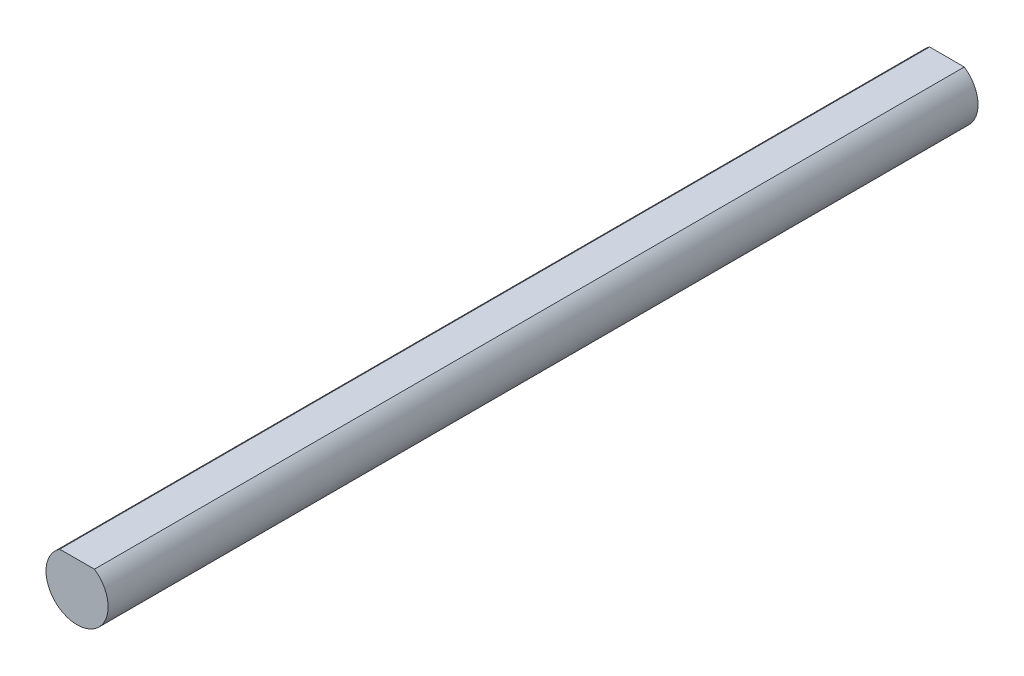
ISO-10303-21;
HEADER;
FILE_DESCRIPTION(('STEP AP214'),'2;1');
FILE_NAME('part.step','',(''),(''),'','','');
FILE_SCHEMA(('AUTOMOTIVE_DESIGN { 1 0 10303 214 1 1 1 1 }'));
ENDSEC;
DATA;
#1=APPLICATION_CONTEXT('core data for automotive mechanical design processes');
#2=APPLICATION_PROTOCOL_DEFINITION('international standard','automotive_design',2000,#1);
#3=PRODUCT_CONTEXT('',#1,'mechanical');
#4=PRODUCT('Part','Part','',(#3));
#5=PRODUCT_RELATED_PRODUCT_CATEGORY('part','',(#4));
#6=PRODUCT_DEFINITION_FORMATION('','',#4);
#7=PRODUCT_DEFINITION_CONTEXT('part definition',#1,'design');
#8=PRODUCT_DEFINITION('design','',#6,#7);
#9=PRODUCT_DEFINITION_SHAPE('','',#8);
#10=(LENGTH_UNIT() NAMED_UNIT(*) SI_UNIT(.MILLI.,.METRE.));
#11=(NAMED_UNIT(*) PLANE_ANGLE_UNIT() SI_UNIT($,.RADIAN.));
#12=(NAMED_UNIT(*) SI_UNIT($,.STERADIAN.) SOLID_ANGLE_UNIT());
#13=UNCERTAINTY_MEASURE_WITH_UNIT(LENGTH_MEASURE(1.E-05),#10,'distance_accuracy_value','');
#14=(GEOMETRIC_REPRESENTATION_CONTEXT(3) GLOBAL_UNCERTAINTY_ASSIGNED_CONTEXT((#13)) GLOBAL_UNIT_ASSIGNED_CONTEXT((#10,
#11,#12)) REPRESENTATION_CONTEXT('',''));
#15=CARTESIAN_POINT('',(0.,0.,0.));
#16=DIRECTION('',(0.,0.,1.));
#17=DIRECTION('',(1.,0.,0.));
#18=AXIS2_PLACEMENT_3D('',#15,#16,#17);
#19=CARTESIAN_POINT('',(0.,0.,50.));
#20=DIRECTION('',(0.,0.,-1.));
#21=DIRECTION('',(-1.,0.,0.));
#22=AXIS2_PLACEMENT_3D('',#19,#20,#21);
#23=CYLINDRICAL_SURFACE('',#22,2.35);
#24=CARTESIAN_POINT('',(0.,0.,15.786));
#25=DIRECTION('',(0.,0.,1.));
#26=DIRECTION('',(1.,0.,0.));
#27=AXIS2_PLACEMENT_3D('',#24,#25,#26);
#28=CIRCLE('',#27,2.35);
#29=CARTESIAN_POINT('',(-1.3114877048604,1.95,15.786));
#30=VERTEX_POINT('',#29);
#31=CARTESIAN_POINT('',(1.3114877048604,1.95,15.786));
#32=VERTEX_POINT('',#31);
#33=EDGE_CURVE('E45',#30,#32,#28,.T.);
#34=ORIENTED_EDGE('',*,*,#33,.F.);
#35=DIRECTION('',(0.,0.,-1.));
#36=VECTOR('',#35,1.);
#37=CARTESIAN_POINT('',(-1.3114877048604,1.95,50.));
#38=LINE('',#37,#36);
#39=CARTESIAN_POINT('',(-1.3114877048604,1.95,-50.));
#40=VERTEX_POINT('',#39);
#41=EDGE_CURVE('E39',#30,#40,#38,.T.);
#42=ORIENTED_EDGE('',*,*,#41,.T.);
#43=CARTESIAN_POINT('',(0.,0.,-50.));
#44=DIRECTION('',(0.,0.,1.));
#45=DIRECTION('',(1.,0.,0.));
#46=AXIS2_PLACEMENT_3D('',#43,#44,#45);
#47=CIRCLE('',#46,2.35);
#48=CARTESIAN_POINT('',(1.3114877048604,1.95,-50.));
#49=VERTEX_POINT('',#48);
#50=EDGE_CURVE('E60',#40,#49,#47,.T.);
#51=ORIENTED_EDGE('',*,*,#50,.T.);
#52=DIRECTION('',(0.,0.,-1.));
#53=VECTOR('',#52,1.);
#54=CARTESIAN_POINT('',(1.3114877048604,1.95,50.));
#55=LINE('',#54,#53);
#56=EDGE_CURVE('E11',#32,#49,#55,.T.);
#57=ORIENTED_EDGE('',*,*,#56,.F.);
#58=EDGE_LOOP('',(#34,#42,#51,#57));
#59=FACE_BOUND('',#58,.T.);
#60=ADVANCED_FACE('F32',(#59),#23,.T.);
#61=CARTESIAN_POINT('',(-1.3114877048604,1.95,50.));
#62=DIRECTION('',(0.,-1.,0.));
#63=DIRECTION('',(0.,0.,-1.));
#64=AXIS2_PLACEMENT_3D('',#61,#62,#63);
#65=PLANE('',#64);
#66=DIRECTION('',(1.,0.,0.));
#67=VECTOR('',#66,1.);
#68=CARTESIAN_POINT('',(0.,1.95,15.786));
#69=LINE('',#68,#67);
#70=EDGE_CURVE('E56',#30,#32,#69,.T.);
#71=ORIENTED_EDGE('',*,*,#70,.T.);
#72=ORIENTED_EDGE('',*,*,#56,.T.);
#73=DIRECTION('',(-1.,0.,0.));
#74=VECTOR('',#73,1.);
#75=CARTESIAN_POINT('',(-1.3114877048604,1.95,-50.));
#76=LINE('',#75,#74);
#77=EDGE_CURVE('E65',#49,#40,#76,.T.);
#78=ORIENTED_EDGE('',*,*,#77,.T.);
#79=ORIENTED_EDGE('',*,*,#41,.F.);
#80=EDGE_LOOP('',(#71,#72,#78,#79));
#81=FACE_BOUND('',#80,.T.);
#82=ADVANCED_FACE('F63',(#81),#65,.F.);
#83=CARTESIAN_POINT('',(0.,0.,-50.));
#84=DIRECTION('',(0.,0.,1.));
#85=DIRECTION('',(1.,0.,0.));
#86=AXIS2_PLACEMENT_3D('',#83,#84,#85);
#87=PLANE('',#86);
#88=ORIENTED_EDGE('',*,*,#50,.F.);
#89=ORIENTED_EDGE('',*,*,#77,.F.);
#90=EDGE_LOOP('',(#88,#89));
#91=FACE_BOUND('',#90,.T.);
#92=ADVANCED_FACE('F70',(#91),#87,.F.);
#93=CARTESIAN_POINT('',(0.,0.,15.786));
#94=DIRECTION('',(0.,0.,1.));
#95=DIRECTION('',(1.,0.,0.));
#96=AXIS2_PLACEMENT_3D('',#93,#94,#95);
#97=PLANE('',#96);
#98=ORIENTED_EDGE('',*,*,#33,.T.);
#99=ORIENTED_EDGE('',*,*,#70,.F.);
#100=EDGE_LOOP('',(#98,#99));
#101=FACE_BOUND('',#100,.T.);
#102=ADVANCED_FACE('F57',(#101),#97,.T.);
#103=CLOSED_SHELL('',(#60,#82,#92,#102));
#104=MANIFOLD_SOLID_BREP('B2',#103);
#105=ADVANCED_BREP_SHAPE_REPRESENTATION('',(#18,#104),#14);
#106=SHAPE_DEFINITION_REPRESENTATION(#9,#105);
ENDSEC;
END-ISO-10303-21;
